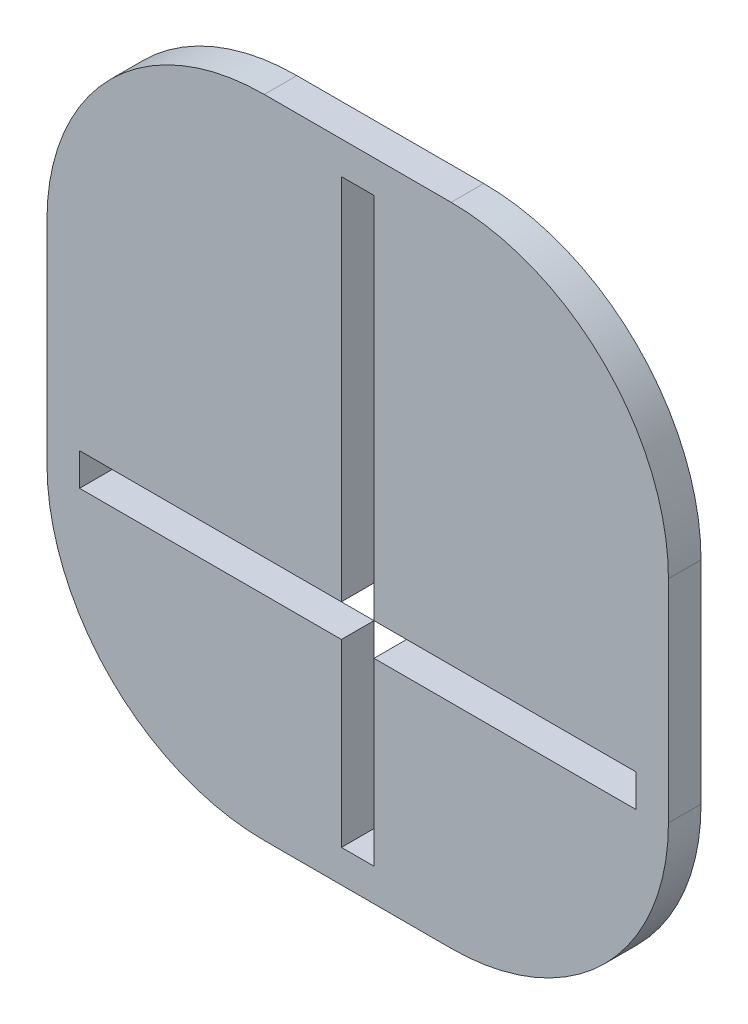
ISO-10303-21;
HEADER;
FILE_DESCRIPTION(('STEP AP214'),'2;1');
FILE_NAME('part.step','',(''),(''),'','','');
FILE_SCHEMA(('AUTOMOTIVE_DESIGN { 1 0 10303 214 1 1 1 1 }'));
ENDSEC;
DATA;
#1=APPLICATION_CONTEXT('core data for automotive mechanical design processes');
#2=APPLICATION_PROTOCOL_DEFINITION('international standard','automotive_design',2000,#1);
#3=PRODUCT_CONTEXT('',#1,'mechanical');
#4=PRODUCT('Part','Part','',(#3));
#5=PRODUCT_RELATED_PRODUCT_CATEGORY('part','',(#4));
#6=PRODUCT_DEFINITION_FORMATION('','',#4);
#7=PRODUCT_DEFINITION_CONTEXT('part definition',#1,'design');
#8=PRODUCT_DEFINITION('design','',#6,#7);
#9=PRODUCT_DEFINITION_SHAPE('','',#8);
#10=(LENGTH_UNIT() NAMED_UNIT(*) SI_UNIT(.MILLI.,.METRE.));
#11=(NAMED_UNIT(*) PLANE_ANGLE_UNIT() SI_UNIT($,.RADIAN.));
#12=(NAMED_UNIT(*) SI_UNIT($,.STERADIAN.) SOLID_ANGLE_UNIT());
#13=UNCERTAINTY_MEASURE_WITH_UNIT(LENGTH_MEASURE(1.E-05),#10,'distance_accuracy_value','');
#14=(GEOMETRIC_REPRESENTATION_CONTEXT(3) GLOBAL_UNCERTAINTY_ASSIGNED_CONTEXT((#13)) GLOBAL_UNIT_ASSIGNED_CONTEXT((#10,
#11,#12)) REPRESENTATION_CONTEXT('',''));
#15=CARTESIAN_POINT('',(0.,0.,0.));
#16=DIRECTION('',(0.,0.,1.));
#17=DIRECTION('',(1.,0.,0.));
#18=AXIS2_PLACEMENT_3D('',#15,#16,#17);
#19=CARTESIAN_POINT('',(0.,29.735,3.));
#20=DIRECTION('',(0.,-1.,0.));
#21=DIRECTION('',(1.,0.,0.));
#22=AXIS2_PLACEMENT_3D('',#19,#20,#21);
#23=PLANE('',#22);
#24=DIRECTION('',(-1.,0.,0.));
#25=VECTOR('',#24,1.);
#26=CARTESIAN_POINT('',(0.,29.735,0.));
#27=LINE('',#26,#25);
#28=CARTESIAN_POINT('',(8.59999999999999,29.735,0.));
#29=VERTEX_POINT('',#28);
#30=CARTESIAN_POINT('',(-8.60000000000003,29.735,0.));
#31=VERTEX_POINT('',#30);
#32=EDGE_CURVE('E254',#29,#31,#27,.T.);
#33=ORIENTED_EDGE('',*,*,#32,.T.);
#34=DIRECTION('',(0.,0.,-1.));
#35=VECTOR('',#34,1.);
#36=CARTESIAN_POINT('',(-8.60000000000003,29.735,3.));
#37=LINE('',#36,#35);
#38=CARTESIAN_POINT('',(-8.60000000000003,29.735,3.));
#39=VERTEX_POINT('',#38);
#40=EDGE_CURVE('E11',#39,#31,#37,.T.);
#41=ORIENTED_EDGE('',*,*,#40,.F.);
#42=DIRECTION('',(-1.,0.,0.));
#43=VECTOR('',#42,1.);
#44=CARTESIAN_POINT('',(0.,29.735,3.));
#45=LINE('',#44,#43);
#46=CARTESIAN_POINT('',(8.59999999999999,29.735,3.));
#47=VERTEX_POINT('',#46);
#48=EDGE_CURVE('E405',#47,#39,#45,.T.);
#49=ORIENTED_EDGE('',*,*,#48,.F.);
#50=DIRECTION('',(0.,0.,-1.));
#51=VECTOR('',#50,1.);
#52=CARTESIAN_POINT('',(8.59999999999999,29.735,3.));
#53=LINE('',#52,#51);
#54=EDGE_CURVE('E281',#47,#29,#53,.T.);
#55=ORIENTED_EDGE('',*,*,#54,.T.);
#56=EDGE_LOOP('',(#33,#41,#49,#55));
#57=FACE_BOUND('',#56,.T.);
#58=ADVANCED_FACE('F45',(#57),#23,.F.);
#59=CARTESIAN_POINT('',(-8.60000000000003,9.73500000000003,3.));
#60=DIRECTION('',(0.,0.,-1.));
#61=DIRECTION('',(-1.,0.,0.));
#62=AXIS2_PLACEMENT_3D('',#59,#60,#61);
#63=CYLINDRICAL_SURFACE('',#62,20.);
#64=CARTESIAN_POINT('',(-8.60000000000003,9.73500000000003,0.));
#65=DIRECTION('',(0.,0.,1.));
#66=DIRECTION('',(1.,0.,0.));
#67=AXIS2_PLACEMENT_3D('',#64,#65,#66);
#68=CIRCLE('',#67,20.);
#69=CARTESIAN_POINT('',(-28.6,9.73500000000002,0.));
#70=VERTEX_POINT('',#69);
#71=EDGE_CURVE('E258',#31,#70,#68,.T.);
#72=ORIENTED_EDGE('',*,*,#71,.T.);
#73=DIRECTION('',(0.,0.,-1.));
#74=VECTOR('',#73,1.);
#75=CARTESIAN_POINT('',(-28.6,9.73500000000002,3.));
#76=LINE('',#75,#74);
#77=CARTESIAN_POINT('',(-28.6,9.73500000000002,3.));
#78=VERTEX_POINT('',#77);
#79=EDGE_CURVE('E56',#78,#70,#76,.T.);
#80=ORIENTED_EDGE('',*,*,#79,.F.);
#81=CARTESIAN_POINT('',(-8.60000000000003,9.73500000000003,3.));
#82=DIRECTION('',(0.,0.,1.));
#83=DIRECTION('',(1.,0.,0.));
#84=AXIS2_PLACEMENT_3D('',#81,#82,#83);
#85=CIRCLE('',#84,20.);
#86=EDGE_CURVE('E408',#39,#78,#85,.T.);
#87=ORIENTED_EDGE('',*,*,#86,.F.);
#88=ORIENTED_EDGE('',*,*,#40,.T.);
#89=EDGE_LOOP('',(#72,#80,#87,#88));
#90=FACE_BOUND('',#89,.T.);
#91=ADVANCED_FACE('F440',(#90),#63,.T.);
#92=CARTESIAN_POINT('',(-28.6,0.,3.));
#93=DIRECTION('',(-1.,0.,0.));
#94=DIRECTION('',(0.,-1.,0.));
#95=AXIS2_PLACEMENT_3D('',#92,#93,#94);
#96=PLANE('',#95);
#97=DIRECTION('',(0.,1.,0.));
#98=VECTOR('',#97,1.);
#99=CARTESIAN_POINT('',(-28.6,0.,0.));
#100=LINE('',#99,#98);
#101=CARTESIAN_POINT('',(-28.6,-9.73500000000002,0.));
#102=VERTEX_POINT('',#101);
#103=EDGE_CURVE('E262',#102,#70,#100,.T.);
#104=ORIENTED_EDGE('',*,*,#103,.F.);
#105=DIRECTION('',(0.,0.,-1.));
#106=VECTOR('',#105,1.);
#107=CARTESIAN_POINT('',(-28.6,-9.73500000000002,3.));
#108=LINE('',#107,#106);
#109=CARTESIAN_POINT('',(-28.6,-9.73500000000002,3.));
#110=VERTEX_POINT('',#109);
#111=EDGE_CURVE('E291',#110,#102,#108,.T.);
#112=ORIENTED_EDGE('',*,*,#111,.F.);
#113=DIRECTION('',(0.,1.,0.));
#114=VECTOR('',#113,1.);
#115=CARTESIAN_POINT('',(-28.6,0.,3.));
#116=LINE('',#115,#114);
#117=EDGE_CURVE('E411',#110,#78,#116,.T.);
#118=ORIENTED_EDGE('',*,*,#117,.T.);
#119=ORIENTED_EDGE('',*,*,#79,.T.);
#120=EDGE_LOOP('',(#104,#112,#118,#119));
#121=FACE_BOUND('',#120,.T.);
#122=ADVANCED_FACE('F445',(#121),#96,.T.);
#123=CARTESIAN_POINT('',(-8.60000000000002,-9.73500000000001,3.));
#124=DIRECTION('',(0.,0.,-1.));
#125=DIRECTION('',(-1.,0.,0.));
#126=AXIS2_PLACEMENT_3D('',#123,#124,#125);
#127=CYLINDRICAL_SURFACE('',#126,20.);
#128=CARTESIAN_POINT('',(-8.60000000000002,-9.73500000000001,0.));
#129=DIRECTION('',(0.,0.,1.));
#130=DIRECTION('',(1.,0.,0.));
#131=AXIS2_PLACEMENT_3D('',#128,#129,#130);
#132=CIRCLE('',#131,20.);
#133=CARTESIAN_POINT('',(-8.60000000000001,-29.735,0.));
#134=VERTEX_POINT('',#133);
#135=EDGE_CURVE('E266',#134,#102,#132,.F.);
#136=ORIENTED_EDGE('',*,*,#135,.F.);
#137=DIRECTION('',(0.,0.,-1.));
#138=VECTOR('',#137,1.);
#139=CARTESIAN_POINT('',(-8.60000000000001,-29.735,3.));
#140=LINE('',#139,#138);
#141=CARTESIAN_POINT('',(-8.60000000000001,-29.735,3.));
#142=VERTEX_POINT('',#141);
#143=EDGE_CURVE('E288',#142,#134,#140,.T.);
#144=ORIENTED_EDGE('',*,*,#143,.F.);
#145=CARTESIAN_POINT('',(-8.60000000000002,-9.73500000000001,3.));
#146=DIRECTION('',(0.,0.,1.));
#147=DIRECTION('',(1.,0.,0.));
#148=AXIS2_PLACEMENT_3D('',#145,#146,#147);
#149=CIRCLE('',#148,20.);
#150=EDGE_CURVE('E415',#142,#110,#149,.F.);
#151=ORIENTED_EDGE('',*,*,#150,.T.);
#152=ORIENTED_EDGE('',*,*,#111,.T.);
#153=EDGE_LOOP('',(#136,#144,#151,#152));
#154=FACE_BOUND('',#153,.T.);
#155=ADVANCED_FACE('F608',(#154),#127,.T.);
#156=CARTESIAN_POINT('',(0.,-29.735,3.));
#157=DIRECTION('',(0.,-1.,0.));
#158=DIRECTION('',(1.,0.,0.));
#159=AXIS2_PLACEMENT_3D('',#156,#157,#158);
#160=PLANE('',#159);
#161=DIRECTION('',(-1.,0.,0.));
#162=VECTOR('',#161,1.);
#163=CARTESIAN_POINT('',(0.,-29.735,0.));
#164=LINE('',#163,#162);
#165=CARTESIAN_POINT('',(8.60000000000001,-29.735,0.));
#166=VERTEX_POINT('',#165);
#167=EDGE_CURVE('E270',#166,#134,#164,.T.);
#168=ORIENTED_EDGE('',*,*,#167,.F.);
#169=DIRECTION('',(0.,0.,-1.));
#170=VECTOR('',#169,1.);
#171=CARTESIAN_POINT('',(8.60000000000001,-29.735,3.));
#172=LINE('',#171,#170);
#173=CARTESIAN_POINT('',(8.60000000000001,-29.735,3.));
#174=VERTEX_POINT('',#173);
#175=EDGE_CURVE('E212',#174,#166,#172,.T.);
#176=ORIENTED_EDGE('',*,*,#175,.F.);
#177=DIRECTION('',(-1.,0.,0.));
#178=VECTOR('',#177,1.);
#179=CARTESIAN_POINT('',(0.,-29.735,3.));
#180=LINE('',#179,#178);
#181=EDGE_CURVE('E203',#174,#142,#180,.T.);
#182=ORIENTED_EDGE('',*,*,#181,.T.);
#183=ORIENTED_EDGE('',*,*,#143,.T.);
#184=EDGE_LOOP('',(#168,#176,#182,#183));
#185=FACE_BOUND('',#184,.T.);
#186=ADVANCED_FACE('F421',(#185),#160,.T.);
#187=CARTESIAN_POINT('',(8.6,-9.735,3.));
#188=DIRECTION('',(0.,0.,-1.));
#189=DIRECTION('',(-1.,0.,0.));
#190=AXIS2_PLACEMENT_3D('',#187,#188,#189);
#191=CYLINDRICAL_SURFACE('',#190,20.);
#192=CARTESIAN_POINT('',(8.6,-9.735,0.));
#193=DIRECTION('',(0.,0.,1.));
#194=DIRECTION('',(1.,0.,0.));
#195=AXIS2_PLACEMENT_3D('',#192,#193,#194);
#196=CIRCLE('',#195,20.);
#197=CARTESIAN_POINT('',(28.6,-9.735,0.));
#198=VERTEX_POINT('',#197);
#199=EDGE_CURVE('E210',#166,#198,#196,.T.);
#200=ORIENTED_EDGE('',*,*,#199,.T.);
#201=DIRECTION('',(0.,0.,-1.));
#202=VECTOR('',#201,1.);
#203=CARTESIAN_POINT('',(28.6,-9.735,3.));
#204=LINE('',#203,#202);
#205=CARTESIAN_POINT('',(28.6,-9.735,3.));
#206=VERTEX_POINT('',#205);
#207=EDGE_CURVE('E207',#206,#198,#204,.T.);
#208=ORIENTED_EDGE('',*,*,#207,.F.);
#209=CARTESIAN_POINT('',(8.6,-9.735,3.));
#210=DIRECTION('',(0.,0.,1.));
#211=DIRECTION('',(1.,0.,0.));
#212=AXIS2_PLACEMENT_3D('',#209,#210,#211);
#213=CIRCLE('',#212,20.);
#214=EDGE_CURVE('E196',#174,#206,#213,.T.);
#215=ORIENTED_EDGE('',*,*,#214,.F.);
#216=ORIENTED_EDGE('',*,*,#175,.T.);
#217=EDGE_LOOP('',(#200,#208,#215,#216));
#218=FACE_BOUND('',#217,.T.);
#219=ADVANCED_FACE('F208',(#218),#191,.T.);
#220=CARTESIAN_POINT('',(28.6,0.,3.));
#221=DIRECTION('',(-1.,0.,0.));
#222=DIRECTION('',(0.,0.,1.));
#223=AXIS2_PLACEMENT_3D('',#220,#221,#222);
#224=PLANE('',#223);
#225=DIRECTION('',(0.,1.,0.));
#226=VECTOR('',#225,1.);
#227=CARTESIAN_POINT('',(28.6,0.,0.));
#228=LINE('',#227,#226);
#229=CARTESIAN_POINT('',(28.6,9.73500000000003,0.));
#230=VERTEX_POINT('',#229);
#231=EDGE_CURVE('E130',#198,#230,#228,.T.);
#232=ORIENTED_EDGE('',*,*,#231,.T.);
#233=DIRECTION('',(0.,0.,-1.));
#234=VECTOR('',#233,1.);
#235=CARTESIAN_POINT('',(28.6,9.73500000000003,3.));
#236=LINE('',#235,#234);
#237=CARTESIAN_POINT('',(28.6,9.73500000000003,3.));
#238=VERTEX_POINT('',#237);
#239=EDGE_CURVE('E213',#238,#230,#236,.T.);
#240=ORIENTED_EDGE('',*,*,#239,.F.);
#241=DIRECTION('',(0.,1.,0.));
#242=VECTOR('',#241,1.);
#243=CARTESIAN_POINT('',(28.6,0.,3.));
#244=LINE('',#243,#242);
#245=EDGE_CURVE('E200',#206,#238,#244,.T.);
#246=ORIENTED_EDGE('',*,*,#245,.F.);
#247=ORIENTED_EDGE('',*,*,#207,.T.);
#248=EDGE_LOOP('',(#232,#240,#246,#247));
#249=FACE_BOUND('',#248,.T.);
#250=ADVANCED_FACE('F215',(#249),#224,.F.);
#251=CARTESIAN_POINT('',(0.,26.735,3.));
#252=DIRECTION('',(0.,1.,0.));
#253=DIRECTION('',(0.,0.,1.));
#254=AXIS2_PLACEMENT_3D('',#251,#252,#253);
#255=PLANE('',#254);
#256=DIRECTION('',(1.,0.,0.));
#257=VECTOR('',#256,1.);
#258=CARTESIAN_POINT('',(0.,26.735,0.));
#259=LINE('',#258,#257);
#260=CARTESIAN_POINT('',(-1.50000000000001,26.735,0.));
#261=VERTEX_POINT('',#260);
#262=CARTESIAN_POINT('',(1.50000000000001,26.735,0.));
#263=VERTEX_POINT('',#262);
#264=EDGE_CURVE('E223',#261,#263,#259,.T.);
#265=ORIENTED_EDGE('',*,*,#264,.T.);
#266=DIRECTION('',(0.,0.,-1.));
#267=VECTOR('',#266,1.);
#268=CARTESIAN_POINT('',(1.50000000000001,26.735,3.));
#269=LINE('',#268,#267);
#270=CARTESIAN_POINT('',(1.50000000000001,26.735,3.));
#271=VERTEX_POINT('',#270);
#272=EDGE_CURVE('E49',#271,#263,#269,.T.);
#273=ORIENTED_EDGE('',*,*,#272,.F.);
#274=DIRECTION('',(1.,0.,0.));
#275=VECTOR('',#274,1.);
#276=CARTESIAN_POINT('',(0.,26.735,3.));
#277=LINE('',#276,#275);
#278=CARTESIAN_POINT('',(-1.50000000000001,26.735,3.));
#279=VERTEX_POINT('',#278);
#280=EDGE_CURVE('E280',#279,#271,#277,.T.);
#281=ORIENTED_EDGE('',*,*,#280,.F.);
#282=DIRECTION('',(0.,0.,-1.));
#283=VECTOR('',#282,1.);
#284=CARTESIAN_POINT('',(-1.50000000000001,26.735,3.));
#285=LINE('',#284,#283);
#286=EDGE_CURVE('E219',#279,#261,#285,.T.);
#287=ORIENTED_EDGE('',*,*,#286,.T.);
#288=EDGE_LOOP('',(#265,#273,#281,#287));
#289=FACE_BOUND('',#288,.T.);
#290=ADVANCED_FACE('F47',(#289),#255,.F.);
#291=CARTESIAN_POINT('',(1.50000000000001,0.,3.));
#292=DIRECTION('',(1.,0.,0.));
#293=DIRECTION('',(0.,0.,-1.));
#294=AXIS2_PLACEMENT_3D('',#291,#292,#293);
#295=PLANE('',#294);
#296=DIRECTION('',(0.,-1.,0.));
#297=VECTOR('',#296,1.);
#298=CARTESIAN_POINT('',(1.50000000000001,0.,0.));
#299=LINE('',#298,#297);
#300=CARTESIAN_POINT('',(1.50000000000001,-7.16000000000001,0.));
#301=VERTEX_POINT('',#300);
#302=EDGE_CURVE('E227',#263,#301,#299,.T.);
#303=ORIENTED_EDGE('',*,*,#302,.T.);
#304=DIRECTION('',(0.,0.,-1.));
#305=VECTOR('',#304,1.);
#306=CARTESIAN_POINT('',(1.50000000000001,-7.16000000000001,3.));
#307=LINE('',#306,#305);
#308=CARTESIAN_POINT('',(1.50000000000001,-7.16000000000001,3.));
#309=VERTEX_POINT('',#308);
#310=EDGE_CURVE('E329',#309,#301,#307,.T.);
#311=ORIENTED_EDGE('',*,*,#310,.F.);
#312=DIRECTION('',(0.,-1.,0.));
#313=VECTOR('',#312,1.);
#314=CARTESIAN_POINT('',(1.50000000000001,0.,3.));
#315=LINE('',#314,#313);
#316=EDGE_CURVE('E145',#271,#309,#315,.T.);
#317=ORIENTED_EDGE('',*,*,#316,.F.);
#318=ORIENTED_EDGE('',*,*,#272,.T.);
#319=EDGE_LOOP('',(#303,#311,#317,#318));
#320=FACE_BOUND('',#319,.T.);
#321=ADVANCED_FACE('F337',(#320),#295,.F.);
#322=CARTESIAN_POINT('',(0.,-7.16000000000001,3.));
#323=DIRECTION('',(0.,1.,0.));
#324=DIRECTION('',(0.,0.,1.));
#325=AXIS2_PLACEMENT_3D('',#322,#323,#324);
#326=PLANE('',#325);
#327=DIRECTION('',(1.,0.,0.));
#328=VECTOR('',#327,1.);
#329=CARTESIAN_POINT('',(0.,-7.16000000000001,0.));
#330=LINE('',#329,#328);
#331=CARTESIAN_POINT('',(25.6,-7.16000000000001,0.));
#332=VERTEX_POINT('',#331);
#333=EDGE_CURVE('E230',#301,#332,#330,.T.);
#334=ORIENTED_EDGE('',*,*,#333,.T.);
#335=DIRECTION('',(0.,0.,-1.));
#336=VECTOR('',#335,1.);
#337=CARTESIAN_POINT('',(25.6,-7.16000000000001,3.));
#338=LINE('',#337,#336);
#339=CARTESIAN_POINT('',(25.6,-7.16000000000001,3.));
#340=VERTEX_POINT('',#339);
#341=EDGE_CURVE('E326',#340,#332,#338,.T.);
#342=ORIENTED_EDGE('',*,*,#341,.F.);
#343=DIRECTION('',(1.,0.,0.));
#344=VECTOR('',#343,1.);
#345=CARTESIAN_POINT('',(0.,-7.16000000000001,3.));
#346=LINE('',#345,#344);
#347=EDGE_CURVE('E477',#309,#340,#346,.T.);
#348=ORIENTED_EDGE('',*,*,#347,.F.);
#349=ORIENTED_EDGE('',*,*,#310,.T.);
#350=EDGE_LOOP('',(#334,#342,#348,#349));
#351=FACE_BOUND('',#350,.T.);
#352=ADVANCED_FACE('F452',(#351),#326,.F.);
#353=CARTESIAN_POINT('',(25.6,0.,3.));
#354=DIRECTION('',(1.,0.,0.));
#355=DIRECTION('',(0.,1.,0.));
#356=AXIS2_PLACEMENT_3D('',#353,#354,#355);
#357=PLANE('',#356);
#358=DIRECTION('',(0.,-1.,0.));
#359=VECTOR('',#358,1.);
#360=CARTESIAN_POINT('',(25.6,0.,0.));
#361=LINE('',#360,#359);
#362=CARTESIAN_POINT('',(25.6,-10.16,0.));
#363=VERTEX_POINT('',#362);
#364=EDGE_CURVE('E234',#332,#363,#361,.T.);
#365=ORIENTED_EDGE('',*,*,#364,.T.);
#366=DIRECTION('',(0.,0.,-1.));
#367=VECTOR('',#366,1.);
#368=CARTESIAN_POINT('',(25.6,-10.16,3.));
#369=LINE('',#368,#367);
#370=CARTESIAN_POINT('',(25.6,-10.16,3.));
#371=VERTEX_POINT('',#370);
#372=EDGE_CURVE('E322',#371,#363,#369,.T.);
#373=ORIENTED_EDGE('',*,*,#372,.F.);
#374=DIRECTION('',(0.,-1.,0.));
#375=VECTOR('',#374,1.);
#376=CARTESIAN_POINT('',(25.6,0.,3.));
#377=LINE('',#376,#375);
#378=EDGE_CURVE('E475',#340,#371,#377,.T.);
#379=ORIENTED_EDGE('',*,*,#378,.F.);
#380=ORIENTED_EDGE('',*,*,#341,.T.);
#381=EDGE_LOOP('',(#365,#373,#379,#380));
#382=FACE_BOUND('',#381,.T.);
#383=ADVANCED_FACE('F461',(#382),#357,.F.);
#384=CARTESIAN_POINT('',(0.,-10.16,3.));
#385=DIRECTION('',(0.,-1.,0.));
#386=DIRECTION('',(0.,0.,-1.));
#387=AXIS2_PLACEMENT_3D('',#384,#385,#386);
#388=PLANE('',#387);
#389=DIRECTION('',(-1.,0.,0.));
#390=VECTOR('',#389,1.);
#391=CARTESIAN_POINT('',(0.,-10.16,0.));
#392=LINE('',#391,#390);
#393=CARTESIAN_POINT('',(1.50000000000001,-10.16,0.));
#394=VERTEX_POINT('',#393);
#395=EDGE_CURVE('E238',#363,#394,#392,.T.);
#396=ORIENTED_EDGE('',*,*,#395,.T.);
#397=DIRECTION('',(0.,0.,-1.));
#398=VECTOR('',#397,1.);
#399=CARTESIAN_POINT('',(1.50000000000001,-10.16,3.));
#400=LINE('',#399,#398);
#401=CARTESIAN_POINT('',(1.50000000000001,-10.16,3.));
#402=VERTEX_POINT('',#401);
#403=EDGE_CURVE('E318',#402,#394,#400,.T.);
#404=ORIENTED_EDGE('',*,*,#403,.F.);
#405=DIRECTION('',(-1.,0.,0.));
#406=VECTOR('',#405,1.);
#407=CARTESIAN_POINT('',(0.,-10.16,3.));
#408=LINE('',#407,#406);
#409=EDGE_CURVE('E397',#371,#402,#408,.T.);
#410=ORIENTED_EDGE('',*,*,#409,.F.);
#411=ORIENTED_EDGE('',*,*,#372,.T.);
#412=EDGE_LOOP('',(#396,#404,#410,#411));
#413=FACE_BOUND('',#412,.T.);
#414=ADVANCED_FACE('F457',(#413),#388,.F.);
#415=CARTESIAN_POINT('',(1.50000000000001,-26.735,0.));
#416=VERTEX_POINT('',#415);
#417=EDGE_CURVE('E231',#394,#416,#299,.T.);
#418=ORIENTED_EDGE('',*,*,#417,.T.);
#419=DIRECTION('',(0.,0.,-1.));
#420=VECTOR('',#419,1.);
#421=CARTESIAN_POINT('',(1.50000000000001,-26.735,3.));
#422=LINE('',#421,#420);
#423=CARTESIAN_POINT('',(1.50000000000001,-26.735,3.));
#424=VERTEX_POINT('',#423);
#425=EDGE_CURVE('E315',#424,#416,#422,.T.);
#426=ORIENTED_EDGE('',*,*,#425,.F.);
#427=EDGE_CURVE('E391',#402,#424,#315,.T.);
#428=ORIENTED_EDGE('',*,*,#427,.F.);
#429=ORIENTED_EDGE('',*,*,#403,.T.);
#430=EDGE_LOOP('',(#418,#426,#428,#429));
#431=FACE_BOUND('',#430,.T.);
#432=ADVANCED_FACE('F377',(#431),#295,.F.);
#433=CARTESIAN_POINT('',(0.,-26.735,3.));
#434=DIRECTION('',(0.,1.,0.));
#435=DIRECTION('',(0.,0.,1.));
#436=AXIS2_PLACEMENT_3D('',#433,#434,#435);
#437=PLANE('',#436);
#438=DIRECTION('',(1.,0.,0.));
#439=VECTOR('',#438,1.);
#440=CARTESIAN_POINT('',(0.,-26.735,0.));
#441=LINE('',#440,#439);
#442=CARTESIAN_POINT('',(-1.50000000000001,-26.735,0.));
#443=VERTEX_POINT('',#442);
#444=EDGE_CURVE('E242',#443,#416,#441,.T.);
#445=ORIENTED_EDGE('',*,*,#444,.F.);
#446=DIRECTION('',(0.,0.,-1.));
#447=VECTOR('',#446,1.);
#448=CARTESIAN_POINT('',(-1.50000000000001,-26.735,3.));
#449=LINE('',#448,#447);
#450=CARTESIAN_POINT('',(-1.50000000000001,-26.735,3.));
#451=VERTEX_POINT('',#450);
#452=EDGE_CURVE('E312',#451,#443,#449,.T.);
#453=ORIENTED_EDGE('',*,*,#452,.F.);
#454=DIRECTION('',(1.,0.,0.));
#455=VECTOR('',#454,1.);
#456=CARTESIAN_POINT('',(0.,-26.735,3.));
#457=LINE('',#456,#455);
#458=EDGE_CURVE('E386',#451,#424,#457,.T.);
#459=ORIENTED_EDGE('',*,*,#458,.T.);
#460=ORIENTED_EDGE('',*,*,#425,.T.);
#461=EDGE_LOOP('',(#445,#453,#459,#460));
#462=FACE_BOUND('',#461,.T.);
#463=ADVANCED_FACE('F384',(#462),#437,.T.);
#464=CARTESIAN_POINT('',(-1.50000000000001,0.,3.));
#465=DIRECTION('',(1.,0.,0.));
#466=DIRECTION('',(0.,0.,-1.));
#467=AXIS2_PLACEMENT_3D('',#464,#465,#466);
#468=PLANE('',#467);
#469=DIRECTION('',(0.,-1.,0.));
#470=VECTOR('',#469,1.);
#471=CARTESIAN_POINT('',(-1.50000000000001,0.,0.));
#472=LINE('',#471,#470);
#473=CARTESIAN_POINT('',(-1.50000000000001,-10.16,0.));
#474=VERTEX_POINT('',#473);
#475=EDGE_CURVE('E246',#474,#443,#472,.T.);
#476=ORIENTED_EDGE('',*,*,#475,.F.);
#477=DIRECTION('',(0.,0.,-1.));
#478=VECTOR('',#477,1.);
#479=CARTESIAN_POINT('',(-1.50000000000001,-10.16,3.));
#480=LINE('',#479,#478);
#481=CARTESIAN_POINT('',(-1.50000000000001,-10.16,3.));
#482=VERTEX_POINT('',#481);
#483=EDGE_CURVE('E309',#482,#474,#480,.T.);
#484=ORIENTED_EDGE('',*,*,#483,.F.);
#485=DIRECTION('',(0.,-1.,0.));
#486=VECTOR('',#485,1.);
#487=CARTESIAN_POINT('',(-1.50000000000001,0.,3.));
#488=LINE('',#487,#486);
#489=EDGE_CURVE('E390',#482,#451,#488,.T.);
#490=ORIENTED_EDGE('',*,*,#489,.T.);
#491=ORIENTED_EDGE('',*,*,#452,.T.);
#492=EDGE_LOOP('',(#476,#484,#490,#491));
#493=FACE_BOUND('',#492,.T.);
#494=ADVANCED_FACE('F436',(#493),#468,.T.);
#495=CARTESIAN_POINT('',(-25.6,-10.16,0.));
#496=VERTEX_POINT('',#495);
#497=EDGE_CURVE('E241',#474,#496,#392,.T.);
#498=ORIENTED_EDGE('',*,*,#497,.T.);
#499=DIRECTION('',(0.,0.,-1.));
#500=VECTOR('',#499,1.);
#501=CARTESIAN_POINT('',(-25.6,-10.16,3.));
#502=LINE('',#501,#500);
#503=CARTESIAN_POINT('',(-25.6,-10.16,3.));
#504=VERTEX_POINT('',#503);
#505=EDGE_CURVE('E305',#504,#496,#502,.T.);
#506=ORIENTED_EDGE('',*,*,#505,.F.);
#507=EDGE_CURVE('E369',#482,#504,#408,.T.);
#508=ORIENTED_EDGE('',*,*,#507,.F.);
#509=ORIENTED_EDGE('',*,*,#483,.T.);
#510=EDGE_LOOP('',(#498,#506,#508,#509));
#511=FACE_BOUND('',#510,.T.);
#512=ADVANCED_FACE('F368',(#511),#388,.F.);
#513=CARTESIAN_POINT('',(-25.6,0.,3.));
#514=DIRECTION('',(-1.,0.,0.));
#515=DIRECTION('',(0.,-1.,0.));
#516=AXIS2_PLACEMENT_3D('',#513,#514,#515);
#517=PLANE('',#516);
#518=DIRECTION('',(0.,1.,0.));
#519=VECTOR('',#518,1.);
#520=CARTESIAN_POINT('',(-25.6,0.,0.));
#521=LINE('',#520,#519);
#522=CARTESIAN_POINT('',(-25.6,-7.16000000000001,0.));
#523=VERTEX_POINT('',#522);
#524=EDGE_CURVE('E251',#496,#523,#521,.T.);
#525=ORIENTED_EDGE('',*,*,#524,.T.);
#526=DIRECTION('',(0.,0.,-1.));
#527=VECTOR('',#526,1.);
#528=CARTESIAN_POINT('',(-25.6,-7.16000000000001,3.));
#529=LINE('',#528,#527);
#530=CARTESIAN_POINT('',(-25.6,-7.16000000000001,3.));
#531=VERTEX_POINT('',#530);
#532=EDGE_CURVE('E301',#531,#523,#529,.T.);
#533=ORIENTED_EDGE('',*,*,#532,.F.);
#534=DIRECTION('',(0.,1.,0.));
#535=VECTOR('',#534,1.);
#536=CARTESIAN_POINT('',(-25.6,0.,3.));
#537=LINE('',#536,#535);
#538=EDGE_CURVE('E365',#504,#531,#537,.T.);
#539=ORIENTED_EDGE('',*,*,#538,.F.);
#540=ORIENTED_EDGE('',*,*,#505,.T.);
#541=EDGE_LOOP('',(#525,#533,#539,#540));
#542=FACE_BOUND('',#541,.T.);
#543=ADVANCED_FACE('F362',(#542),#517,.F.);
#544=CARTESIAN_POINT('',(-1.50000000000001,-7.16000000000001,0.));
#545=VERTEX_POINT('',#544);
#546=EDGE_CURVE('E235',#523,#545,#330,.T.);
#547=ORIENTED_EDGE('',*,*,#546,.T.);
#548=DIRECTION('',(0.,0.,-1.));
#549=VECTOR('',#548,1.);
#550=CARTESIAN_POINT('',(-1.50000000000001,-7.16000000000001,3.));
#551=LINE('',#550,#549);
#552=CARTESIAN_POINT('',(-1.50000000000001,-7.16000000000001,3.));
#553=VERTEX_POINT('',#552);
#554=EDGE_CURVE('E298',#553,#545,#551,.T.);
#555=ORIENTED_EDGE('',*,*,#554,.F.);
#556=EDGE_CURVE('E404',#531,#553,#346,.T.);
#557=ORIENTED_EDGE('',*,*,#556,.F.);
#558=ORIENTED_EDGE('',*,*,#532,.T.);
#559=EDGE_LOOP('',(#547,#555,#557,#558));
#560=FACE_BOUND('',#559,.T.);
#561=ADVANCED_FACE('F355',(#560),#326,.F.);
#562=EDGE_CURVE('E250',#261,#545,#472,.T.);
#563=ORIENTED_EDGE('',*,*,#562,.F.);
#564=ORIENTED_EDGE('',*,*,#286,.F.);
#565=EDGE_CURVE('E396',#279,#553,#488,.T.);
#566=ORIENTED_EDGE('',*,*,#565,.T.);
#567=ORIENTED_EDGE('',*,*,#554,.T.);
#568=EDGE_LOOP('',(#563,#564,#566,#567));
#569=FACE_BOUND('',#568,.T.);
#570=ADVANCED_FACE('F348',(#569),#468,.T.);
#571=CARTESIAN_POINT('',(8.6,9.73500000000003,3.));
#572=DIRECTION('',(0.,0.,-1.));
#573=DIRECTION('',(-1.,0.,0.));
#574=AXIS2_PLACEMENT_3D('',#571,#572,#573);
#575=CYLINDRICAL_SURFACE('',#574,20.);
#576=CARTESIAN_POINT('',(8.6,9.73500000000003,0.));
#577=DIRECTION('',(0.,0.,1.));
#578=DIRECTION('',(1.,0.,0.));
#579=AXIS2_PLACEMENT_3D('',#576,#577,#578);
#580=CIRCLE('',#579,20.);
#581=EDGE_CURVE('E136',#230,#29,#580,.T.);
#582=ORIENTED_EDGE('',*,*,#581,.T.);
#583=ORIENTED_EDGE('',*,*,#54,.F.);
#584=CARTESIAN_POINT('',(8.6,9.73500000000003,3.));
#585=DIRECTION('',(0.,0.,1.));
#586=DIRECTION('',(1.,0.,0.));
#587=AXIS2_PLACEMENT_3D('',#584,#585,#586);
#588=CIRCLE('',#587,20.);
#589=EDGE_CURVE('E65',#238,#47,#588,.T.);
#590=ORIENTED_EDGE('',*,*,#589,.F.);
#591=ORIENTED_EDGE('',*,*,#239,.T.);
#592=EDGE_LOOP('',(#582,#583,#590,#591));
#593=FACE_BOUND('',#592,.T.);
#594=ADVANCED_FACE('F427',(#593),#575,.T.);
#595=CARTESIAN_POINT('',(0.,0.,3.));
#596=DIRECTION('',(0.,0.,1.));
#597=DIRECTION('',(1.,0.,0.));
#598=AXIS2_PLACEMENT_3D('',#595,#596,#597);
#599=PLANE('',#598);
#600=ORIENTED_EDGE('',*,*,#280,.T.);
#601=ORIENTED_EDGE('',*,*,#316,.T.);
#602=ORIENTED_EDGE('',*,*,#347,.T.);
#603=ORIENTED_EDGE('',*,*,#378,.T.);
#604=ORIENTED_EDGE('',*,*,#409,.T.);
#605=ORIENTED_EDGE('',*,*,#427,.T.);
#606=ORIENTED_EDGE('',*,*,#458,.F.);
#607=ORIENTED_EDGE('',*,*,#489,.F.);
#608=ORIENTED_EDGE('',*,*,#507,.T.);
#609=ORIENTED_EDGE('',*,*,#538,.T.);
#610=ORIENTED_EDGE('',*,*,#556,.T.);
#611=ORIENTED_EDGE('',*,*,#565,.F.);
#612=EDGE_LOOP('',(#600,#601,#602,#603,#604,#605,#606,#607,#608,#609,#610,#611));
#613=FACE_BOUND('',#612,.T.);
#614=ORIENTED_EDGE('',*,*,#48,.T.);
#615=ORIENTED_EDGE('',*,*,#86,.T.);
#616=ORIENTED_EDGE('',*,*,#117,.F.);
#617=ORIENTED_EDGE('',*,*,#150,.F.);
#618=ORIENTED_EDGE('',*,*,#181,.F.);
#619=ORIENTED_EDGE('',*,*,#214,.T.);
#620=ORIENTED_EDGE('',*,*,#245,.T.);
#621=ORIENTED_EDGE('',*,*,#589,.T.);
#622=EDGE_LOOP('',(#614,#615,#616,#617,#618,#619,#620,#621));
#623=FACE_BOUND('',#622,.T.);
#624=ADVANCED_FACE('F198',(#613,#623),#599,.T.);
#625=CARTESIAN_POINT('',(0.,0.,0.));
#626=DIRECTION('',(0.,0.,1.));
#627=DIRECTION('',(1.,0.,0.));
#628=AXIS2_PLACEMENT_3D('',#625,#626,#627);
#629=PLANE('',#628);
#630=ORIENTED_EDGE('',*,*,#264,.F.);
#631=ORIENTED_EDGE('',*,*,#562,.T.);
#632=ORIENTED_EDGE('',*,*,#546,.F.);
#633=ORIENTED_EDGE('',*,*,#524,.F.);
#634=ORIENTED_EDGE('',*,*,#497,.F.);
#635=ORIENTED_EDGE('',*,*,#475,.T.);
#636=ORIENTED_EDGE('',*,*,#444,.T.);
#637=ORIENTED_EDGE('',*,*,#417,.F.);
#638=ORIENTED_EDGE('',*,*,#395,.F.);
#639=ORIENTED_EDGE('',*,*,#364,.F.);
#640=ORIENTED_EDGE('',*,*,#333,.F.);
#641=ORIENTED_EDGE('',*,*,#302,.F.);
#642=EDGE_LOOP('',(#630,#631,#632,#633,#634,#635,#636,#637,#638,#639,#640,#641));
#643=FACE_BOUND('',#642,.T.);
#644=ORIENTED_EDGE('',*,*,#32,.F.);
#645=ORIENTED_EDGE('',*,*,#581,.F.);
#646=ORIENTED_EDGE('',*,*,#231,.F.);
#647=ORIENTED_EDGE('',*,*,#199,.F.);
#648=ORIENTED_EDGE('',*,*,#167,.T.);
#649=ORIENTED_EDGE('',*,*,#135,.T.);
#650=ORIENTED_EDGE('',*,*,#103,.T.);
#651=ORIENTED_EDGE('',*,*,#71,.F.);
#652=EDGE_LOOP('',(#644,#645,#646,#647,#648,#649,#650,#651));
#653=FACE_BOUND('',#652,.T.);
#654=ADVANCED_FACE('F344',(#643,#653),#629,.F.);
#655=CLOSED_SHELL('',(#58,#91,#122,#155,#186,#219,#250,#290,#321,#352,#383,#414,#432,#463,#494,
#512,#543,#561,#570,#594,#624,#654));
#656=MANIFOLD_SOLID_BREP('B2',#655);
#657=ADVANCED_BREP_SHAPE_REPRESENTATION('',(#18,#656),#14);
#658=SHAPE_DEFINITION_REPRESENTATION(#9,#657);
ENDSEC;
END-ISO-10303-21;
